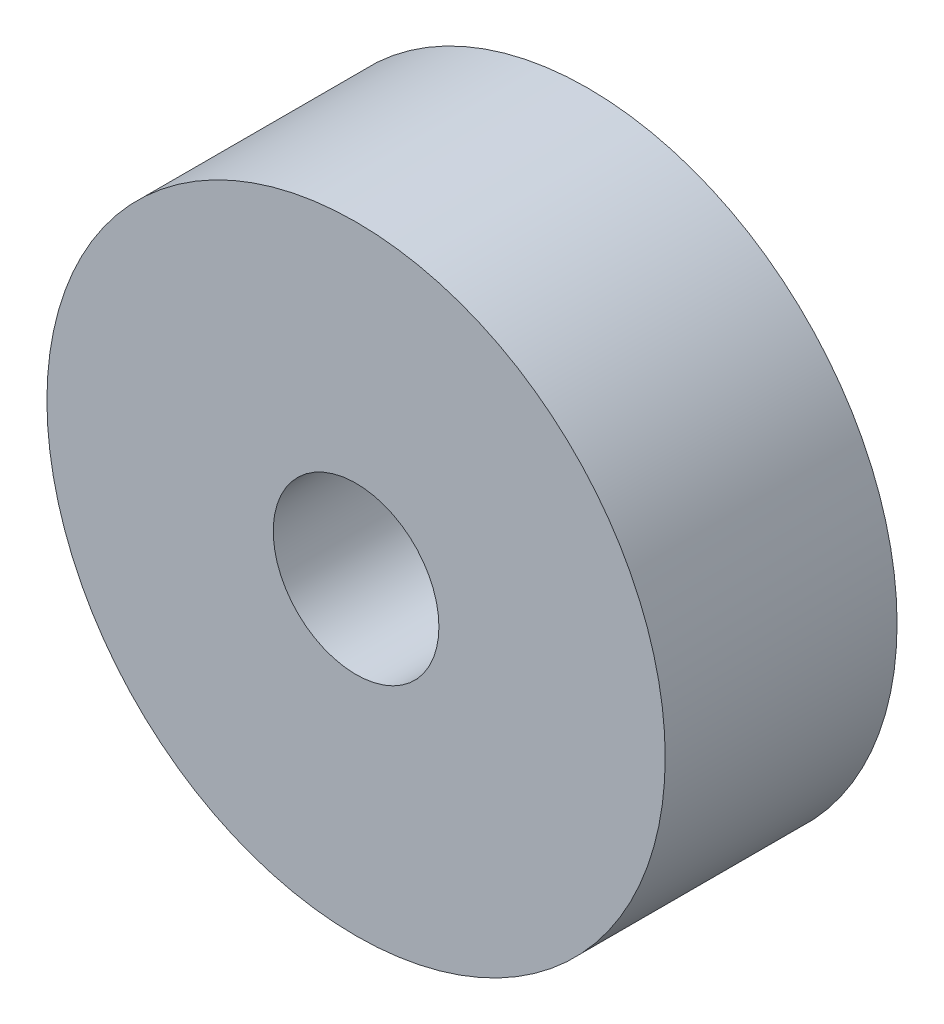
ISO-10303-21;
HEADER;
FILE_DESCRIPTION(('STEP AP214'),'2;1');
FILE_NAME('part.step','',(''),(''),'','','');
FILE_SCHEMA(('AUTOMOTIVE_DESIGN { 1 0 10303 214 1 1 1 1 }'));
ENDSEC;
DATA;
#1=APPLICATION_CONTEXT('core data for automotive mechanical design processes');
#2=APPLICATION_PROTOCOL_DEFINITION('international standard','automotive_design',2000,#1);
#3=PRODUCT_CONTEXT('',#1,'mechanical');
#4=PRODUCT('Part','Part','',(#3));
#5=PRODUCT_RELATED_PRODUCT_CATEGORY('part','',(#4));
#6=PRODUCT_DEFINITION_FORMATION('','',#4);
#7=PRODUCT_DEFINITION_CONTEXT('part definition',#1,'design');
#8=PRODUCT_DEFINITION('design','',#6,#7);
#9=PRODUCT_DEFINITION_SHAPE('','',#8);
#10=(LENGTH_UNIT() NAMED_UNIT(*) SI_UNIT(.MILLI.,.METRE.));
#11=(NAMED_UNIT(*) PLANE_ANGLE_UNIT() SI_UNIT($,.RADIAN.));
#12=(NAMED_UNIT(*) SI_UNIT($,.STERADIAN.) SOLID_ANGLE_UNIT());
#13=UNCERTAINTY_MEASURE_WITH_UNIT(LENGTH_MEASURE(1.E-05),#10,'distance_accuracy_value','');
#14=(GEOMETRIC_REPRESENTATION_CONTEXT(3) GLOBAL_UNCERTAINTY_ASSIGNED_CONTEXT((#13)) GLOBAL_UNIT_ASSIGNED_CONTEXT((#10,
#11,#12)) REPRESENTATION_CONTEXT('',''));
#15=CARTESIAN_POINT('',(0.,0.,0.));
#16=DIRECTION('',(0.,0.,1.));
#17=DIRECTION('',(1.,0.,0.));
#18=AXIS2_PLACEMENT_3D('',#15,#16,#17);
#19=CARTESIAN_POINT('',(0.,0.,30.));
#20=DIRECTION('',(0.,0.,-1.));
#21=DIRECTION('',(-1.,0.,0.));
#22=AXIS2_PLACEMENT_3D('',#19,#20,#21);
#23=CYLINDRICAL_SURFACE('',#22,40.);
#24=CARTESIAN_POINT('',(0.,0.,30.));
#25=DIRECTION('',(0.,0.,1.));
#26=DIRECTION('',(1.,0.,0.));
#27=AXIS2_PLACEMENT_3D('',#24,#25,#26);
#28=CIRCLE('',#27,40.);
#29=CARTESIAN_POINT('',(40.,0.,30.));
#30=VERTEX_POINT('',#29);
#31=EDGE_CURVE('E10',#30,#30,#28,.T.);
#32=ORIENTED_EDGE('',*,*,#31,.F.);
#33=EDGE_LOOP('',(#32));
#34=FACE_BOUND('',#33,.T.);
#35=CARTESIAN_POINT('',(0.,0.,0.));
#36=DIRECTION('',(0.,0.,1.));
#37=DIRECTION('',(1.,0.,0.));
#38=AXIS2_PLACEMENT_3D('',#35,#36,#37);
#39=CIRCLE('',#38,40.);
#40=CARTESIAN_POINT('',(40.,0.,0.));
#41=VERTEX_POINT('',#40);
#42=EDGE_CURVE('E42',#41,#41,#39,.T.);
#43=ORIENTED_EDGE('',*,*,#42,.T.);
#44=EDGE_LOOP('',(#43));
#45=FACE_BOUND('',#44,.T.);
#46=ADVANCED_FACE('F39',(#34,#45),#23,.T.);
#47=CARTESIAN_POINT('',(0.,0.,30.));
#48=DIRECTION('',(0.,0.,1.));
#49=DIRECTION('',(1.,0.,0.));
#50=AXIS2_PLACEMENT_3D('',#47,#48,#49);
#51=PLANE('',#50);
#52=CARTESIAN_POINT('',(0.,0.,30.));
#53=DIRECTION('',(0.,0.,1.));
#54=DIRECTION('',(1.,0.,0.));
#55=AXIS2_PLACEMENT_3D('',#52,#53,#54);
#56=CIRCLE('',#55,10.7200241);
#57=CARTESIAN_POINT('',(10.7200241,0.,30.));
#58=VERTEX_POINT('',#57);
#59=EDGE_CURVE('E51',#58,#58,#56,.T.);
#60=ORIENTED_EDGE('',*,*,#59,.F.);
#61=EDGE_LOOP('',(#60));
#62=FACE_BOUND('',#61,.T.);
#63=ORIENTED_EDGE('',*,*,#31,.T.);
#64=EDGE_LOOP('',(#63));
#65=FACE_BOUND('',#64,.T.);
#66=ADVANCED_FACE('F66',(#62,#65),#51,.T.);
#67=CARTESIAN_POINT('',(0.,0.,0.));
#68=DIRECTION('',(0.,0.,1.));
#69=DIRECTION('',(1.,0.,0.));
#70=AXIS2_PLACEMENT_3D('',#67,#68,#69);
#71=PLANE('',#70);
#72=CARTESIAN_POINT('',(0.,0.,0.));
#73=DIRECTION('',(0.,0.,1.));
#74=DIRECTION('',(1.,0.,0.));
#75=AXIS2_PLACEMENT_3D('',#72,#73,#74);
#76=CIRCLE('',#75,10.7200241);
#77=CARTESIAN_POINT('',(10.7200241,0.,0.));
#78=VERTEX_POINT('',#77);
#79=EDGE_CURVE('E49',#78,#78,#76,.T.);
#80=ORIENTED_EDGE('',*,*,#79,.T.);
#81=EDGE_LOOP('',(#80));
#82=FACE_BOUND('',#81,.T.);
#83=ORIENTED_EDGE('',*,*,#42,.F.);
#84=EDGE_LOOP('',(#83));
#85=FACE_BOUND('',#84,.T.);
#86=ADVANCED_FACE('F57',(#82,#85),#71,.F.);
#87=CARTESIAN_POINT('',(0.,0.,0.));
#88=DIRECTION('',(0.,0.,1.));
#89=DIRECTION('',(1.,0.,0.));
#90=AXIS2_PLACEMENT_3D('',#87,#88,#89);
#91=CYLINDRICAL_SURFACE('',#90,10.7200241);
#92=ORIENTED_EDGE('',*,*,#79,.F.);
#93=EDGE_LOOP('',(#92));
#94=FACE_BOUND('',#93,.T.);
#95=ORIENTED_EDGE('',*,*,#59,.T.);
#96=EDGE_LOOP('',(#95));
#97=FACE_BOUND('',#96,.T.);
#98=ADVANCED_FACE('F60',(#94,#97),#91,.F.);
#99=CLOSED_SHELL('',(#46,#66,#86,#98));
#100=MANIFOLD_SOLID_BREP('B2',#99);
#101=ADVANCED_BREP_SHAPE_REPRESENTATION('',(#18,#100),#14);
#102=SHAPE_DEFINITION_REPRESENTATION(#9,#101);
ENDSEC;
END-ISO-10303-21;
